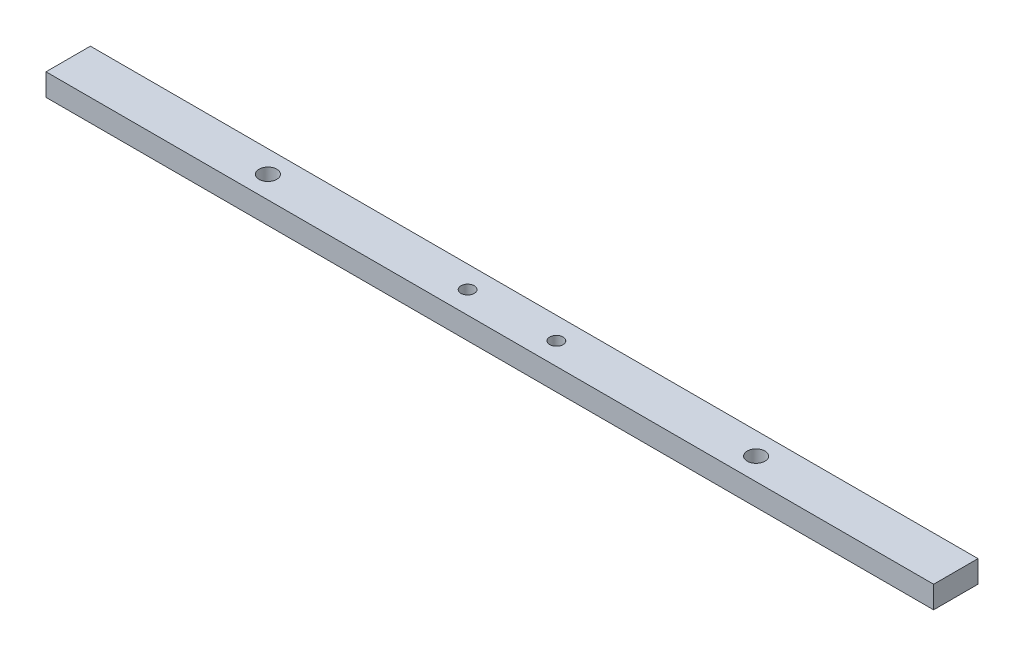
ISO-10303-21;
HEADER;
FILE_DESCRIPTION(('STEP AP214'),'2;1');
FILE_NAME('part.step','',(''),(''),'','','');
FILE_SCHEMA(('AUTOMOTIVE_DESIGN { 1 0 10303 214 1 1 1 1 }'));
ENDSEC;
DATA;
#1=APPLICATION_CONTEXT('core data for automotive mechanical design processes');
#2=APPLICATION_PROTOCOL_DEFINITION('international standard','automotive_design',2000,#1);
#3=PRODUCT_CONTEXT('',#1,'mechanical');
#4=PRODUCT('Part','Part','',(#3));
#5=PRODUCT_RELATED_PRODUCT_CATEGORY('part','',(#4));
#6=PRODUCT_DEFINITION_FORMATION('','',#4);
#7=PRODUCT_DEFINITION_CONTEXT('part definition',#1,'design');
#8=PRODUCT_DEFINITION('design','',#6,#7);
#9=PRODUCT_DEFINITION_SHAPE('','',#8);
#10=(LENGTH_UNIT() NAMED_UNIT(*) SI_UNIT(.MILLI.,.METRE.));
#11=(NAMED_UNIT(*) PLANE_ANGLE_UNIT() SI_UNIT($,.RADIAN.));
#12=(NAMED_UNIT(*) SI_UNIT($,.STERADIAN.) SOLID_ANGLE_UNIT());
#13=UNCERTAINTY_MEASURE_WITH_UNIT(LENGTH_MEASURE(1.E-05),#10,'distance_accuracy_value','');
#14=(GEOMETRIC_REPRESENTATION_CONTEXT(3) GLOBAL_UNCERTAINTY_ASSIGNED_CONTEXT((#13)) GLOBAL_UNIT_ASSIGNED_CONTEXT((#10,
#11,#12)) REPRESENTATION_CONTEXT('',''));
#15=CARTESIAN_POINT('',(0.,0.,0.));
#16=DIRECTION('',(0.,0.,1.));
#17=DIRECTION('',(1.,0.,0.));
#18=AXIS2_PLACEMENT_3D('',#15,#16,#17);
#19=CARTESIAN_POINT('',(0.,0.,10.));
#20=DIRECTION('',(1.,0.,0.));
#21=DIRECTION('',(0.,1.,0.));
#22=AXIS2_PLACEMENT_3D('',#19,#20,#21);
#23=PLANE('',#22);
#24=DIRECTION('',(0.,-1.,0.));
#25=VECTOR('',#24,1.);
#26=CARTESIAN_POINT('',(0.,0.,0.));
#27=LINE('',#26,#25);
#28=CARTESIAN_POINT('',(0.,0.,0.));
#29=VERTEX_POINT('',#28);
#30=CARTESIAN_POINT('',(0.,-5.,0.));
#31=VERTEX_POINT('',#30);
#32=EDGE_CURVE('E99',#29,#31,#27,.T.);
#33=ORIENTED_EDGE('',*,*,#32,.T.);
#34=DIRECTION('',(0.,0.,-1.));
#35=VECTOR('',#34,1.);
#36=CARTESIAN_POINT('',(0.,-5.,10.));
#37=LINE('',#36,#35);
#38=CARTESIAN_POINT('',(0.,-5.,10.));
#39=VERTEX_POINT('',#38);
#40=EDGE_CURVE('E11',#39,#31,#37,.T.);
#41=ORIENTED_EDGE('',*,*,#40,.F.);
#42=DIRECTION('',(0.,-1.,0.));
#43=VECTOR('',#42,1.);
#44=CARTESIAN_POINT('',(0.,0.,10.));
#45=LINE('',#44,#43);
#46=CARTESIAN_POINT('',(0.,0.,10.));
#47=VERTEX_POINT('',#46);
#48=EDGE_CURVE('E86',#47,#39,#45,.T.);
#49=ORIENTED_EDGE('',*,*,#48,.F.);
#50=DIRECTION('',(0.,0.,-1.));
#51=VECTOR('',#50,1.);
#52=CARTESIAN_POINT('',(0.,0.,10.));
#53=LINE('',#52,#51);
#54=EDGE_CURVE('E95',#47,#29,#53,.T.);
#55=ORIENTED_EDGE('',*,*,#54,.T.);
#56=EDGE_LOOP('',(#33,#41,#49,#55));
#57=FACE_BOUND('',#56,.T.);
#58=ADVANCED_FACE('F33',(#57),#23,.F.);
#59=CARTESIAN_POINT('',(0.,-5.,10.));
#60=DIRECTION('',(0.,1.,0.));
#61=DIRECTION('',(0.,0.,1.));
#62=AXIS2_PLACEMENT_3D('',#59,#60,#61);
#63=PLANE('',#62);
#64=CARTESIAN_POINT('',(90.,-5.,5.));
#65=DIRECTION('',(0.,-1.,0.));
#66=DIRECTION('',(0.,0.,-1.));
#67=AXIS2_PLACEMENT_3D('',#64,#65,#66);
#68=CIRCLE('',#67,1.5);
#69=CARTESIAN_POINT('',(90.,-5.,3.5));
#70=VERTEX_POINT('',#69);
#71=EDGE_CURVE('E126',#70,#70,#68,.T.);
#72=ORIENTED_EDGE('',*,*,#71,.F.);
#73=EDGE_LOOP('',(#72));
#74=FACE_BOUND('',#73,.T.);
#75=CARTESIAN_POINT('',(110.,-5.,5.));
#76=DIRECTION('',(0.,-1.,0.));
#77=DIRECTION('',(0.,0.,-1.));
#78=AXIS2_PLACEMENT_3D('',#75,#76,#77);
#79=CIRCLE('',#78,1.5);
#80=CARTESIAN_POINT('',(110.,-5.,3.5));
#81=VERTEX_POINT('',#80);
#82=EDGE_CURVE('E116',#81,#81,#79,.T.);
#83=ORIENTED_EDGE('',*,*,#82,.F.);
#84=EDGE_LOOP('',(#83));
#85=FACE_BOUND('',#84,.T.);
#86=CARTESIAN_POINT('',(155.,-5.,5.));
#87=DIRECTION('',(0.,-1.,0.));
#88=DIRECTION('',(0.,0.,-1.));
#89=AXIS2_PLACEMENT_3D('',#86,#87,#88);
#90=CIRCLE('',#89,2.);
#91=CARTESIAN_POINT('',(155.,-5.,3.));
#92=VERTEX_POINT('',#91);
#93=EDGE_CURVE('E113',#92,#92,#90,.T.);
#94=ORIENTED_EDGE('',*,*,#93,.F.);
#95=EDGE_LOOP('',(#94));
#96=FACE_BOUND('',#95,.T.);
#97=CARTESIAN_POINT('',(45.,-5.,5.));
#98=DIRECTION('',(0.,-1.,0.));
#99=DIRECTION('',(0.,0.,-1.));
#100=AXIS2_PLACEMENT_3D('',#97,#98,#99);
#101=CIRCLE('',#100,2.);
#102=CARTESIAN_POINT('',(45.,-5.,3.));
#103=VERTEX_POINT('',#102);
#104=EDGE_CURVE('E110',#103,#103,#101,.T.);
#105=ORIENTED_EDGE('',*,*,#104,.F.);
#106=EDGE_LOOP('',(#105));
#107=FACE_BOUND('',#106,.T.);
#108=DIRECTION('',(1.,0.,0.));
#109=VECTOR('',#108,1.);
#110=CARTESIAN_POINT('',(0.,-5.,0.));
#111=LINE('',#110,#109);
#112=CARTESIAN_POINT('',(200.,-5.,0.));
#113=VERTEX_POINT('',#112);
#114=EDGE_CURVE('E90',#31,#113,#111,.T.);
#115=ORIENTED_EDGE('',*,*,#114,.T.);
#116=DIRECTION('',(0.,0.,-1.));
#117=VECTOR('',#116,1.);
#118=CARTESIAN_POINT('',(200.,-5.,10.));
#119=LINE('',#118,#117);
#120=CARTESIAN_POINT('',(200.,-5.,10.));
#121=VERTEX_POINT('',#120);
#122=EDGE_CURVE('E42',#121,#113,#119,.T.);
#123=ORIENTED_EDGE('',*,*,#122,.F.);
#124=DIRECTION('',(1.,0.,0.));
#125=VECTOR('',#124,1.);
#126=CARTESIAN_POINT('',(0.,-5.,10.));
#127=LINE('',#126,#125);
#128=EDGE_CURVE('E81',#39,#121,#127,.T.);
#129=ORIENTED_EDGE('',*,*,#128,.F.);
#130=ORIENTED_EDGE('',*,*,#40,.T.);
#131=EDGE_LOOP('',(#115,#123,#129,#130));
#132=FACE_BOUND('',#131,.T.);
#133=ADVANCED_FACE('F89',(#74,#85,#96,#107,#132),#63,.F.);
#134=CARTESIAN_POINT('',(200.,0.,10.));
#135=DIRECTION('',(-1.,0.,0.));
#136=DIRECTION('',(0.,0.,1.));
#137=AXIS2_PLACEMENT_3D('',#134,#135,#136);
#138=PLANE('',#137);
#139=DIRECTION('',(0.,1.,0.));
#140=VECTOR('',#139,1.);
#141=CARTESIAN_POINT('',(200.,0.,0.));
#142=LINE('',#141,#140);
#143=CARTESIAN_POINT('',(200.,0.,0.));
#144=VERTEX_POINT('',#143);
#145=EDGE_CURVE('E68',#113,#144,#142,.T.);
#146=ORIENTED_EDGE('',*,*,#145,.T.);
#147=DIRECTION('',(0.,0.,-1.));
#148=VECTOR('',#147,1.);
#149=CARTESIAN_POINT('',(200.,0.,10.));
#150=LINE('',#149,#148);
#151=CARTESIAN_POINT('',(200.,0.,10.));
#152=VERTEX_POINT('',#151);
#153=EDGE_CURVE('E91',#152,#144,#150,.T.);
#154=ORIENTED_EDGE('',*,*,#153,.F.);
#155=DIRECTION('',(0.,1.,0.));
#156=VECTOR('',#155,1.);
#157=CARTESIAN_POINT('',(200.,0.,10.));
#158=LINE('',#157,#156);
#159=EDGE_CURVE('E84',#121,#152,#158,.T.);
#160=ORIENTED_EDGE('',*,*,#159,.F.);
#161=ORIENTED_EDGE('',*,*,#122,.T.);
#162=EDGE_LOOP('',(#146,#154,#160,#161));
#163=FACE_BOUND('',#162,.T.);
#164=ADVANCED_FACE('F93',(#163),#138,.F.);
#165=CARTESIAN_POINT('',(0.,0.,10.));
#166=DIRECTION('',(0.,-1.,0.));
#167=DIRECTION('',(0.,0.,-1.));
#168=AXIS2_PLACEMENT_3D('',#165,#166,#167);
#169=PLANE('',#168);
#170=CARTESIAN_POINT('',(90.,0.,5.));
#171=DIRECTION('',(0.,-1.,0.));
#172=DIRECTION('',(0.,0.,-1.));
#173=AXIS2_PLACEMENT_3D('',#170,#171,#172);
#174=CIRCLE('',#173,1.5);
#175=CARTESIAN_POINT('',(90.,0.,3.5));
#176=VERTEX_POINT('',#175);
#177=EDGE_CURVE('E36',#176,#176,#174,.T.);
#178=ORIENTED_EDGE('',*,*,#177,.T.);
#179=EDGE_LOOP('',(#178));
#180=FACE_BOUND('',#179,.T.);
#181=CARTESIAN_POINT('',(110.,0.,5.));
#182=DIRECTION('',(0.,-1.,0.));
#183=DIRECTION('',(0.,0.,-1.));
#184=AXIS2_PLACEMENT_3D('',#181,#182,#183);
#185=CIRCLE('',#184,1.5);
#186=CARTESIAN_POINT('',(110.,0.,3.5));
#187=VERTEX_POINT('',#186);
#188=EDGE_CURVE('E114',#187,#187,#185,.T.);
#189=ORIENTED_EDGE('',*,*,#188,.T.);
#190=EDGE_LOOP('',(#189));
#191=FACE_BOUND('',#190,.T.);
#192=CARTESIAN_POINT('',(155.,0.,5.));
#193=DIRECTION('',(0.,-1.,0.));
#194=DIRECTION('',(0.,0.,-1.));
#195=AXIS2_PLACEMENT_3D('',#192,#193,#194);
#196=CIRCLE('',#195,2.);
#197=CARTESIAN_POINT('',(155.,0.,3.));
#198=VERTEX_POINT('',#197);
#199=EDGE_CURVE('E111',#198,#198,#196,.T.);
#200=ORIENTED_EDGE('',*,*,#199,.T.);
#201=EDGE_LOOP('',(#200));
#202=FACE_BOUND('',#201,.T.);
#203=CARTESIAN_POINT('',(45.,0.,5.));
#204=DIRECTION('',(0.,-1.,0.));
#205=DIRECTION('',(0.,0.,-1.));
#206=AXIS2_PLACEMENT_3D('',#203,#204,#205);
#207=CIRCLE('',#206,2.);
#208=CARTESIAN_POINT('',(45.,0.,3.));
#209=VERTEX_POINT('',#208);
#210=EDGE_CURVE('E102',#209,#209,#207,.T.);
#211=ORIENTED_EDGE('',*,*,#210,.T.);
#212=EDGE_LOOP('',(#211));
#213=FACE_BOUND('',#212,.T.);
#214=DIRECTION('',(-1.,0.,0.));
#215=VECTOR('',#214,1.);
#216=CARTESIAN_POINT('',(0.,0.,0.));
#217=LINE('',#216,#215);
#218=EDGE_CURVE('E74',#144,#29,#217,.T.);
#219=ORIENTED_EDGE('',*,*,#218,.T.);
#220=ORIENTED_EDGE('',*,*,#54,.F.);
#221=DIRECTION('',(-1.,0.,0.));
#222=VECTOR('',#221,1.);
#223=CARTESIAN_POINT('',(0.,0.,10.));
#224=LINE('',#223,#222);
#225=EDGE_CURVE('E51',#152,#47,#224,.T.);
#226=ORIENTED_EDGE('',*,*,#225,.F.);
#227=ORIENTED_EDGE('',*,*,#153,.T.);
#228=EDGE_LOOP('',(#219,#220,#226,#227));
#229=FACE_BOUND('',#228,.T.);
#230=ADVANCED_FACE('F141',(#180,#191,#202,#213,#229),#169,.F.);
#231=CARTESIAN_POINT('',(0.,0.,10.));
#232=DIRECTION('',(0.,0.,1.));
#233=DIRECTION('',(1.,0.,0.));
#234=AXIS2_PLACEMENT_3D('',#231,#232,#233);
#235=PLANE('',#234);
#236=ORIENTED_EDGE('',*,*,#48,.T.);
#237=ORIENTED_EDGE('',*,*,#128,.T.);
#238=ORIENTED_EDGE('',*,*,#159,.T.);
#239=ORIENTED_EDGE('',*,*,#225,.T.);
#240=EDGE_LOOP('',(#236,#237,#238,#239));
#241=FACE_BOUND('',#240,.T.);
#242=ADVANCED_FACE('F82',(#241),#235,.T.);
#243=CARTESIAN_POINT('',(0.,0.,0.));
#244=DIRECTION('',(0.,0.,1.));
#245=DIRECTION('',(1.,0.,0.));
#246=AXIS2_PLACEMENT_3D('',#243,#244,#245);
#247=PLANE('',#246);
#248=ORIENTED_EDGE('',*,*,#32,.F.);
#249=ORIENTED_EDGE('',*,*,#218,.F.);
#250=ORIENTED_EDGE('',*,*,#145,.F.);
#251=ORIENTED_EDGE('',*,*,#114,.F.);
#252=EDGE_LOOP('',(#248,#249,#250,#251));
#253=FACE_BOUND('',#252,.T.);
#254=ADVANCED_FACE('F150',(#253),#247,.F.);
#255=CARTESIAN_POINT('',(45.,5.,5.));
#256=DIRECTION('',(0.,-1.,0.));
#257=DIRECTION('',(0.,0.,-1.));
#258=AXIS2_PLACEMENT_3D('',#255,#256,#257);
#259=CYLINDRICAL_SURFACE('',#258,2.);
#260=ORIENTED_EDGE('',*,*,#104,.T.);
#261=EDGE_LOOP('',(#260));
#262=FACE_BOUND('',#261,.T.);
#263=ORIENTED_EDGE('',*,*,#210,.F.);
#264=EDGE_LOOP('',(#263));
#265=FACE_BOUND('',#264,.T.);
#266=ADVANCED_FACE('F132',(#262,#265),#259,.F.);
#267=CARTESIAN_POINT('',(155.,5.,5.));
#268=DIRECTION('',(0.,-1.,0.));
#269=DIRECTION('',(0.,0.,-1.));
#270=AXIS2_PLACEMENT_3D('',#267,#268,#269);
#271=CYLINDRICAL_SURFACE('',#270,2.);
#272=ORIENTED_EDGE('',*,*,#93,.T.);
#273=EDGE_LOOP('',(#272));
#274=FACE_BOUND('',#273,.T.);
#275=ORIENTED_EDGE('',*,*,#199,.F.);
#276=EDGE_LOOP('',(#275));
#277=FACE_BOUND('',#276,.T.);
#278=ADVANCED_FACE('F158',(#274,#277),#271,.F.);
#279=CARTESIAN_POINT('',(110.,5.,5.));
#280=DIRECTION('',(0.,-1.,0.));
#281=DIRECTION('',(0.,0.,-1.));
#282=AXIS2_PLACEMENT_3D('',#279,#280,#281);
#283=CYLINDRICAL_SURFACE('',#282,1.5);
#284=ORIENTED_EDGE('',*,*,#82,.T.);
#285=EDGE_LOOP('',(#284));
#286=FACE_BOUND('',#285,.T.);
#287=ORIENTED_EDGE('',*,*,#188,.F.);
#288=EDGE_LOOP('',(#287));
#289=FACE_BOUND('',#288,.T.);
#290=ADVANCED_FACE('F161',(#286,#289),#283,.F.);
#291=CARTESIAN_POINT('',(90.,5.,5.));
#292=DIRECTION('',(0.,-1.,0.));
#293=DIRECTION('',(0.,0.,-1.));
#294=AXIS2_PLACEMENT_3D('',#291,#292,#293);
#295=CYLINDRICAL_SURFACE('',#294,1.5);
#296=ORIENTED_EDGE('',*,*,#71,.T.);
#297=EDGE_LOOP('',(#296));
#298=FACE_BOUND('',#297,.T.);
#299=ORIENTED_EDGE('',*,*,#177,.F.);
#300=EDGE_LOOP('',(#299));
#301=FACE_BOUND('',#300,.T.);
#302=ADVANCED_FACE('F165',(#298,#301),#295,.F.);
#303=CLOSED_SHELL('',(#58,#133,#164,#230,#242,#254,#266,#278,#290,#302));
#304=MANIFOLD_SOLID_BREP('B2',#303);
#305=ADVANCED_BREP_SHAPE_REPRESENTATION('',(#18,#304),#14);
#306=SHAPE_DEFINITION_REPRESENTATION(#9,#305);
ENDSEC;
END-ISO-10303-21;
